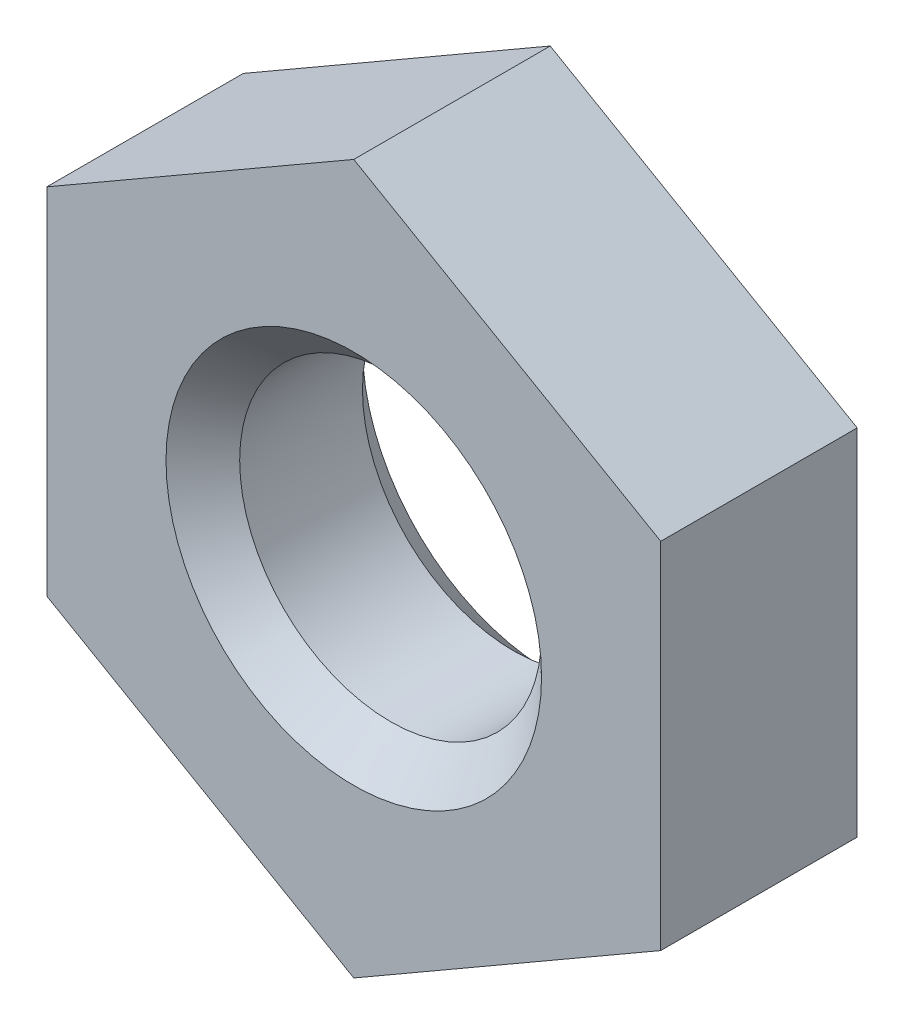
ISO-10303-21;
HEADER;
FILE_DESCRIPTION(('STEP AP214'),'2;1');
FILE_NAME('part.step','',(''),(''),'','','');
FILE_SCHEMA(('AUTOMOTIVE_DESIGN { 1 0 10303 214 1 1 1 1 }'));
ENDSEC;
DATA;
#1=APPLICATION_CONTEXT('core data for automotive mechanical design processes');
#2=APPLICATION_PROTOCOL_DEFINITION('international standard','automotive_design',2000,#1);
#3=PRODUCT_CONTEXT('',#1,'mechanical');
#4=PRODUCT('Part','Part','',(#3));
#5=PRODUCT_RELATED_PRODUCT_CATEGORY('part','',(#4));
#6=PRODUCT_DEFINITION_FORMATION('','',#4);
#7=PRODUCT_DEFINITION_CONTEXT('part definition',#1,'design');
#8=PRODUCT_DEFINITION('design','',#6,#7);
#9=PRODUCT_DEFINITION_SHAPE('','',#8);
#10=(LENGTH_UNIT() NAMED_UNIT(*) SI_UNIT(.MILLI.,.METRE.));
#11=(NAMED_UNIT(*) PLANE_ANGLE_UNIT() SI_UNIT($,.RADIAN.));
#12=(NAMED_UNIT(*) SI_UNIT($,.STERADIAN.) SOLID_ANGLE_UNIT());
#13=UNCERTAINTY_MEASURE_WITH_UNIT(LENGTH_MEASURE(1.E-05),#10,'distance_accuracy_value','');
#14=(GEOMETRIC_REPRESENTATION_CONTEXT(3) GLOBAL_UNCERTAINTY_ASSIGNED_CONTEXT((#13)) GLOBAL_UNIT_ASSIGNED_CONTEXT((#10,
#11,#12)) REPRESENTATION_CONTEXT('',''));
#15=CARTESIAN_POINT('',(0.,0.,0.));
#16=DIRECTION('',(0.,0.,1.));
#17=DIRECTION('',(1.,0.,0.));
#18=AXIS2_PLACEMENT_3D('',#15,#16,#17);
#19=CARTESIAN_POINT('',(-5.,-2.88675134594813,0.));
#20=DIRECTION('',(-1.,0.,0.));
#21=DIRECTION('',(0.,0.,1.));
#22=AXIS2_PLACEMENT_3D('',#19,#20,#21);
#23=PLANE('',#22);
#24=DIRECTION('',(0.,1.,0.));
#25=VECTOR('',#24,1.);
#26=CARTESIAN_POINT('',(-5.,2.88675134594813,3.2));
#27=LINE('',#26,#25);
#28=CARTESIAN_POINT('',(-5.,-2.88675134594813,3.2));
#29=VERTEX_POINT('',#28);
#30=CARTESIAN_POINT('',(-5.,2.88675134594813,3.2));
#31=VERTEX_POINT('',#30);
#32=EDGE_CURVE('E149',#29,#31,#27,.T.);
#33=ORIENTED_EDGE('',*,*,#32,.T.);
#34=DIRECTION('',(0.,0.,1.));
#35=VECTOR('',#34,1.);
#36=CARTESIAN_POINT('',(-5.,2.88675134594813,0.));
#37=LINE('',#36,#35);
#38=CARTESIAN_POINT('',(-5.,2.88675134594813,0.));
#39=VERTEX_POINT('',#38);
#40=EDGE_CURVE('E161',#39,#31,#37,.T.);
#41=ORIENTED_EDGE('',*,*,#40,.F.);
#42=DIRECTION('',(0.,-1.,0.));
#43=VECTOR('',#42,1.);
#44=CARTESIAN_POINT('',(-5.,2.88675134594813,0.));
#45=LINE('',#44,#43);
#46=CARTESIAN_POINT('',(-5.,-2.88675134594813,0.));
#47=VERTEX_POINT('',#46);
#48=EDGE_CURVE('E21',#39,#47,#45,.T.);
#49=ORIENTED_EDGE('',*,*,#48,.T.);
#50=DIRECTION('',(0.,0.,1.));
#51=VECTOR('',#50,1.);
#52=CARTESIAN_POINT('',(-5.,-2.88675134594813,0.));
#53=LINE('',#52,#51);
#54=EDGE_CURVE('E11',#47,#29,#53,.T.);
#55=ORIENTED_EDGE('',*,*,#54,.T.);
#56=EDGE_LOOP('',(#33,#41,#49,#55));
#57=FACE_BOUND('',#56,.T.);
#58=ADVANCED_FACE('F17',(#57),#23,.T.);
#59=CARTESIAN_POINT('',(0.,-5.77350269189626,0.));
#60=DIRECTION('',(-0.5,-0.866025403784439,0.));
#61=DIRECTION('',(-0.866025403784439,0.5,0.));
#62=AXIS2_PLACEMENT_3D('',#59,#60,#61);
#63=PLANE('',#62);
#64=DIRECTION('',(-0.866025403784439,0.5,0.));
#65=VECTOR('',#64,1.);
#66=CARTESIAN_POINT('',(-5.,-2.88675134594813,3.2));
#67=LINE('',#66,#65);
#68=CARTESIAN_POINT('',(0.,-5.77350269189626,3.2));
#69=VERTEX_POINT('',#68);
#70=EDGE_CURVE('E186',#69,#29,#67,.T.);
#71=ORIENTED_EDGE('',*,*,#70,.T.);
#72=ORIENTED_EDGE('',*,*,#54,.F.);
#73=DIRECTION('',(0.866025403784439,-0.5,0.));
#74=VECTOR('',#73,1.);
#75=CARTESIAN_POINT('',(-5.,-2.88675134594813,0.));
#76=LINE('',#75,#74);
#77=CARTESIAN_POINT('',(0.,-5.77350269189626,0.));
#78=VERTEX_POINT('',#77);
#79=EDGE_CURVE('E113',#47,#78,#76,.T.);
#80=ORIENTED_EDGE('',*,*,#79,.T.);
#81=DIRECTION('',(0.,0.,1.));
#82=VECTOR('',#81,1.);
#83=CARTESIAN_POINT('',(0.,-5.77350269189626,0.));
#84=LINE('',#83,#82);
#85=EDGE_CURVE('E27',#78,#69,#84,.T.);
#86=ORIENTED_EDGE('',*,*,#85,.T.);
#87=EDGE_LOOP('',(#71,#72,#80,#86));
#88=FACE_BOUND('',#87,.T.);
#89=ADVANCED_FACE('F214',(#88),#63,.T.);
#90=CARTESIAN_POINT('',(5.,-2.88675134594813,0.));
#91=DIRECTION('',(0.5,-0.866025403784439,0.));
#92=DIRECTION('',(0.,0.,-1.));
#93=AXIS2_PLACEMENT_3D('',#90,#91,#92);
#94=PLANE('',#93);
#95=DIRECTION('',(-0.866025403784439,-0.5,0.));
#96=VECTOR('',#95,1.);
#97=CARTESIAN_POINT('',(0.,-5.77350269189626,3.2));
#98=LINE('',#97,#96);
#99=CARTESIAN_POINT('',(5.,-2.88675134594813,3.2));
#100=VERTEX_POINT('',#99);
#101=EDGE_CURVE('E164',#100,#69,#98,.T.);
#102=ORIENTED_EDGE('',*,*,#101,.T.);
#103=ORIENTED_EDGE('',*,*,#85,.F.);
#104=DIRECTION('',(0.866025403784439,0.5,0.));
#105=VECTOR('',#104,1.);
#106=CARTESIAN_POINT('',(0.,-5.77350269189626,0.));
#107=LINE('',#106,#105);
#108=CARTESIAN_POINT('',(5.,-2.88675134594813,0.));
#109=VERTEX_POINT('',#108);
#110=EDGE_CURVE('E107',#78,#109,#107,.T.);
#111=ORIENTED_EDGE('',*,*,#110,.T.);
#112=DIRECTION('',(0.,0.,1.));
#113=VECTOR('',#112,1.);
#114=CARTESIAN_POINT('',(5.,-2.88675134594813,0.));
#115=LINE('',#114,#113);
#116=EDGE_CURVE('E53',#109,#100,#115,.T.);
#117=ORIENTED_EDGE('',*,*,#116,.T.);
#118=EDGE_LOOP('',(#102,#103,#111,#117));
#119=FACE_BOUND('',#118,.T.);
#120=ADVANCED_FACE('F108',(#119),#94,.T.);
#121=CARTESIAN_POINT('',(5.,2.88675134594813,0.));
#122=DIRECTION('',(1.,0.,0.));
#123=DIRECTION('',(0.,1.,0.));
#124=AXIS2_PLACEMENT_3D('',#121,#122,#123);
#125=PLANE('',#124);
#126=DIRECTION('',(0.,-1.,0.));
#127=VECTOR('',#126,1.);
#128=CARTESIAN_POINT('',(5.,-2.88675134594813,3.2));
#129=LINE('',#128,#127);
#130=CARTESIAN_POINT('',(5.,2.88675134594813,3.2));
#131=VERTEX_POINT('',#130);
#132=EDGE_CURVE('E102',#131,#100,#129,.T.);
#133=ORIENTED_EDGE('',*,*,#132,.T.);
#134=ORIENTED_EDGE('',*,*,#116,.F.);
#135=DIRECTION('',(0.,1.,0.));
#136=VECTOR('',#135,1.);
#137=CARTESIAN_POINT('',(5.,-2.88675134594813,0.));
#138=LINE('',#137,#136);
#139=CARTESIAN_POINT('',(5.,2.88675134594813,0.));
#140=VERTEX_POINT('',#139);
#141=EDGE_CURVE('E99',#109,#140,#138,.T.);
#142=ORIENTED_EDGE('',*,*,#141,.T.);
#143=DIRECTION('',(0.,0.,1.));
#144=VECTOR('',#143,1.);
#145=CARTESIAN_POINT('',(5.,2.88675134594813,0.));
#146=LINE('',#145,#144);
#147=EDGE_CURVE('E40',#140,#131,#146,.T.);
#148=ORIENTED_EDGE('',*,*,#147,.T.);
#149=EDGE_LOOP('',(#133,#134,#142,#148));
#150=FACE_BOUND('',#149,.T.);
#151=ADVANCED_FACE('F97',(#150),#125,.T.);
#152=CARTESIAN_POINT('',(0.,5.77350269189626,0.));
#153=DIRECTION('',(0.5,0.866025403784439,0.));
#154=DIRECTION('',(0.,0.,-1.));
#155=AXIS2_PLACEMENT_3D('',#152,#153,#154);
#156=PLANE('',#155);
#157=DIRECTION('',(0.866025403784439,-0.5,0.));
#158=VECTOR('',#157,1.);
#159=CARTESIAN_POINT('',(5.,2.88675134594813,3.2));
#160=LINE('',#159,#158);
#161=CARTESIAN_POINT('',(0.,5.77350269189626,3.2));
#162=VERTEX_POINT('',#161);
#163=EDGE_CURVE('E163',#162,#131,#160,.T.);
#164=ORIENTED_EDGE('',*,*,#163,.T.);
#165=ORIENTED_EDGE('',*,*,#147,.F.);
#166=DIRECTION('',(-0.866025403784439,0.5,0.));
#167=VECTOR('',#166,1.);
#168=CARTESIAN_POINT('',(5.,2.88675134594813,0.));
#169=LINE('',#168,#167);
#170=CARTESIAN_POINT('',(0.,5.77350269189626,0.));
#171=VERTEX_POINT('',#170);
#172=EDGE_CURVE('E119',#140,#171,#169,.T.);
#173=ORIENTED_EDGE('',*,*,#172,.T.);
#174=DIRECTION('',(0.,0.,1.));
#175=VECTOR('',#174,1.);
#176=CARTESIAN_POINT('',(0.,5.77350269189626,0.));
#177=LINE('',#176,#175);
#178=EDGE_CURVE('E168',#171,#162,#177,.T.);
#179=ORIENTED_EDGE('',*,*,#178,.T.);
#180=EDGE_LOOP('',(#164,#165,#173,#179));
#181=FACE_BOUND('',#180,.T.);
#182=ADVANCED_FACE('F19',(#181),#156,.T.);
#183=CARTESIAN_POINT('',(-5.,2.88675134594813,0.));
#184=DIRECTION('',(-0.5,0.866025403784439,0.));
#185=DIRECTION('',(0.,0.,1.));
#186=AXIS2_PLACEMENT_3D('',#183,#184,#185);
#187=PLANE('',#186);
#188=DIRECTION('',(0.866025403784439,0.5,0.));
#189=VECTOR('',#188,1.);
#190=CARTESIAN_POINT('',(0.,5.77350269189626,3.2));
#191=LINE('',#190,#189);
#192=EDGE_CURVE('E137',#31,#162,#191,.T.);
#193=ORIENTED_EDGE('',*,*,#192,.T.);
#194=ORIENTED_EDGE('',*,*,#178,.F.);
#195=DIRECTION('',(-0.866025403784439,-0.5,0.));
#196=VECTOR('',#195,1.);
#197=CARTESIAN_POINT('',(0.,5.77350269189626,0.));
#198=LINE('',#197,#196);
#199=EDGE_CURVE('E126',#171,#39,#198,.T.);
#200=ORIENTED_EDGE('',*,*,#199,.T.);
#201=ORIENTED_EDGE('',*,*,#40,.T.);
#202=EDGE_LOOP('',(#193,#194,#200,#201));
#203=FACE_BOUND('',#202,.T.);
#204=ADVANCED_FACE('F243',(#203),#187,.T.);
#205=CARTESIAN_POINT('',(0.,0.,3.2));
#206=DIRECTION('',(0.,0.,1.));
#207=DIRECTION('',(1.,0.,0.));
#208=AXIS2_PLACEMENT_3D('',#205,#206,#207);
#209=PLANE('',#208);
#210=CARTESIAN_POINT('',(0.,0.,3.2));
#211=DIRECTION('',(0.,0.,1.));
#212=DIRECTION('',(-1.,0.,0.));
#213=AXIS2_PLACEMENT_3D('',#210,#211,#212);
#214=CIRCLE('',#213,3.0585);
#215=CARTESIAN_POINT('',(3.0585,0.,3.2));
#216=VERTEX_POINT('',#215);
#217=EDGE_CURVE('E138',#216,#216,#214,.T.);
#218=ORIENTED_EDGE('',*,*,#217,.F.);
#219=EDGE_LOOP('',(#218));
#220=FACE_BOUND('',#219,.T.);
#221=ORIENTED_EDGE('',*,*,#192,.F.);
#222=ORIENTED_EDGE('',*,*,#32,.F.);
#223=ORIENTED_EDGE('',*,*,#70,.F.);
#224=ORIENTED_EDGE('',*,*,#101,.F.);
#225=ORIENTED_EDGE('',*,*,#132,.F.);
#226=ORIENTED_EDGE('',*,*,#163,.F.);
#227=EDGE_LOOP('',(#221,#222,#223,#224,#225,#226));
#228=FACE_BOUND('',#227,.T.);
#229=ADVANCED_FACE('F217',(#220,#228),#209,.T.);
#230=CARTESIAN_POINT('',(0.,0.,2.9));
#231=DIRECTION('',(0.,0.,1.));
#232=DIRECTION('',(-1.,0.,0.));
#233=AXIS2_PLACEMENT_3D('',#230,#231,#232);
#234=CONICAL_SURFACE('',#233,2.7585,0.785398163397448);
#235=ORIENTED_EDGE('',*,*,#217,.T.);
#236=DIRECTION('',(-0.707106781186547,0.,-0.707106781186548));
#237=VECTOR('',#236,1.);
#238=CARTESIAN_POINT('',(2.7585,0.,2.9));
#239=LINE('',#238,#237);
#240=CARTESIAN_POINT('',(2.4585,0.,2.6));
#241=VERTEX_POINT('',#240);
#242=EDGE_CURVE('E135',#216,#241,#239,.T.);
#243=ORIENTED_EDGE('',*,*,#242,.T.);
#244=CARTESIAN_POINT('',(0.,0.,2.6));
#245=DIRECTION('',(0.,0.,-1.));
#246=DIRECTION('',(-1.,0.,0.));
#247=AXIS2_PLACEMENT_3D('',#244,#245,#246);
#248=CIRCLE('',#247,2.4585);
#249=CARTESIAN_POINT('',(-2.4585,0.,2.6));
#250=VERTEX_POINT('',#249);
#251=EDGE_CURVE('E133',#241,#250,#248,.T.);
#252=ORIENTED_EDGE('',*,*,#251,.T.);
#253=CARTESIAN_POINT('',(0.,0.,2.6));
#254=DIRECTION('',(0.,0.,-1.));
#255=DIRECTION('',(-1.,0.,0.));
#256=AXIS2_PLACEMENT_3D('',#253,#254,#255);
#257=CIRCLE('',#256,2.4585);
#258=EDGE_CURVE('E175',#250,#241,#257,.T.);
#259=ORIENTED_EDGE('',*,*,#258,.T.);
#260=ORIENTED_EDGE('',*,*,#242,.F.);
#261=EDGE_LOOP('',(#235,#243,#252,#259,#260));
#262=FACE_BOUND('',#261,.T.);
#263=ADVANCED_FACE('F231',(#262),#234,.F.);
#264=CARTESIAN_POINT('',(0.,0.,0.));
#265=DIRECTION('',(0.,0.,1.));
#266=DIRECTION('',(1.,0.,0.));
#267=AXIS2_PLACEMENT_3D('',#264,#265,#266);
#268=PLANE('',#267);
#269=CARTESIAN_POINT('',(0.,0.,0.));
#270=DIRECTION('',(0.,0.,-1.));
#271=DIRECTION('',(1.,0.,0.));
#272=AXIS2_PLACEMENT_3D('',#269,#270,#271);
#273=CIRCLE('',#272,3.0585);
#274=CARTESIAN_POINT('',(-3.0585,0.,0.));
#275=VERTEX_POINT('',#274);
#276=EDGE_CURVE('E172',#275,#275,#273,.T.);
#277=ORIENTED_EDGE('',*,*,#276,.F.);
#278=EDGE_LOOP('',(#277));
#279=FACE_BOUND('',#278,.T.);
#280=ORIENTED_EDGE('',*,*,#48,.F.);
#281=ORIENTED_EDGE('',*,*,#199,.F.);
#282=ORIENTED_EDGE('',*,*,#172,.F.);
#283=ORIENTED_EDGE('',*,*,#141,.F.);
#284=ORIENTED_EDGE('',*,*,#110,.F.);
#285=ORIENTED_EDGE('',*,*,#79,.F.);
#286=EDGE_LOOP('',(#280,#281,#282,#283,#284,#285));
#287=FACE_BOUND('',#286,.T.);
#288=ADVANCED_FACE('F116',(#279,#287),#268,.F.);
#289=CARTESIAN_POINT('',(0.,0.,-12.4068361090047));
#290=DIRECTION('',(0.,0.,1.));
#291=DIRECTION('',(1.,0.,0.));
#292=AXIS2_PLACEMENT_3D('',#289,#290,#291);
#293=CYLINDRICAL_SURFACE('',#292,2.4585);
#294=ORIENTED_EDGE('',*,*,#251,.F.);
#295=ORIENTED_EDGE('',*,*,#258,.F.);
#296=DIRECTION('',(0.,0.,-1.));
#297=VECTOR('',#296,1.);
#298=CARTESIAN_POINT('',(-2.4585,0.,-12.4068361090047));
#299=LINE('',#298,#297);
#300=CARTESIAN_POINT('',(-2.4585,0.,0.6));
#301=VERTEX_POINT('',#300);
#302=EDGE_CURVE('E191',#250,#301,#299,.T.);
#303=ORIENTED_EDGE('',*,*,#302,.T.);
#304=CARTESIAN_POINT('',(0.,0.,0.6));
#305=DIRECTION('',(0.,0.,1.));
#306=DIRECTION('',(1.,0.,0.));
#307=AXIS2_PLACEMENT_3D('',#304,#305,#306);
#308=CIRCLE('',#307,2.4585);
#309=EDGE_CURVE('E130',#301,#301,#308,.T.);
#310=ORIENTED_EDGE('',*,*,#309,.F.);
#311=ORIENTED_EDGE('',*,*,#302,.F.);
#312=EDGE_LOOP('',(#294,#295,#303,#310,#311));
#313=FACE_BOUND('',#312,.T.);
#314=ADVANCED_FACE('F240',(#313),#293,.F.);
#315=CARTESIAN_POINT('',(0.,0.,0.3));
#316=DIRECTION('',(0.,0.,-1.));
#317=DIRECTION('',(1.,0.,0.));
#318=AXIS2_PLACEMENT_3D('',#315,#316,#317);
#319=CONICAL_SURFACE('',#318,2.7585,0.785398163397448);
#320=ORIENTED_EDGE('',*,*,#276,.T.);
#321=DIRECTION('',(0.707106781186547,0.,0.707106781186548));
#322=VECTOR('',#321,1.);
#323=CARTESIAN_POINT('',(-2.7585,0.,0.3));
#324=LINE('',#323,#322);
#325=EDGE_CURVE('E134',#275,#301,#324,.T.);
#326=ORIENTED_EDGE('',*,*,#325,.T.);
#327=ORIENTED_EDGE('',*,*,#309,.T.);
#328=ORIENTED_EDGE('',*,*,#325,.F.);
#329=EDGE_LOOP('',(#320,#326,#327,#328));
#330=FACE_BOUND('',#329,.T.);
#331=ADVANCED_FACE('F258',(#330),#319,.F.);
#332=CLOSED_SHELL('',(#58,#89,#120,#151,#182,#204,#229,#263,#288,#314,#331));
#333=MANIFOLD_SOLID_BREP('B1',#332);
#334=ADVANCED_BREP_SHAPE_REPRESENTATION('',(#18,#333),#14);
#335=SHAPE_DEFINITION_REPRESENTATION(#9,#334);
ENDSEC;
END-ISO-10303-21;
